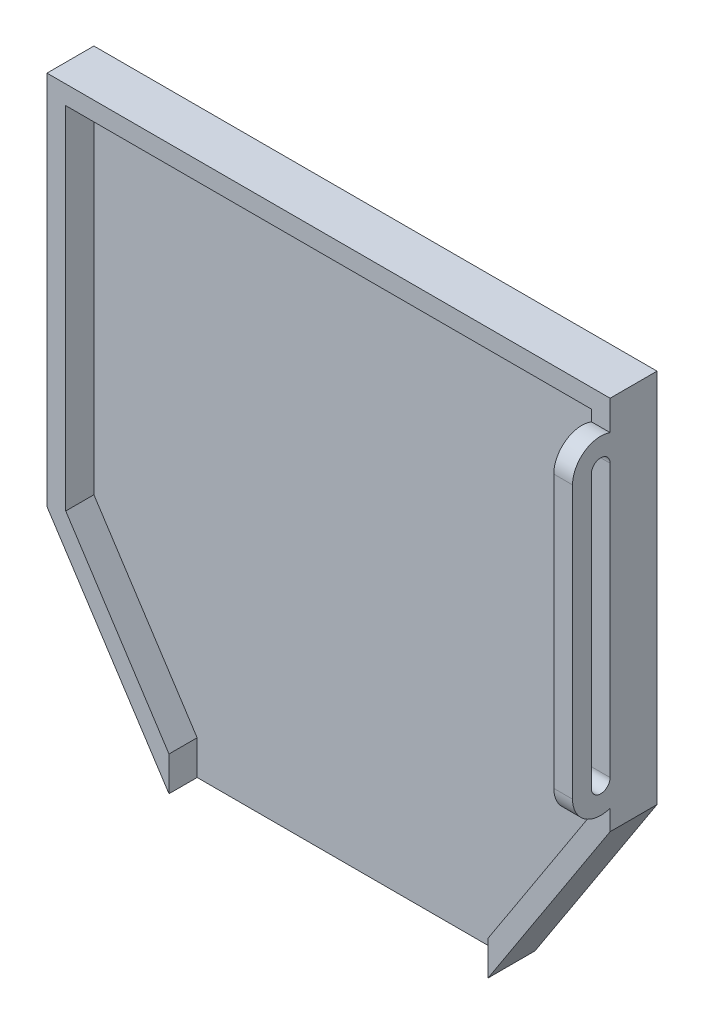
ISO-10303-21;
HEADER;
FILE_DESCRIPTION(('STEP AP214'),'2;1');
FILE_NAME('part.step','',(''),(''),'','','');
FILE_SCHEMA(('AUTOMOTIVE_DESIGN { 1 0 10303 214 1 1 1 1 }'));
ENDSEC;
DATA;
#1=APPLICATION_CONTEXT('core data for automotive mechanical design processes');
#2=APPLICATION_PROTOCOL_DEFINITION('international standard','automotive_design',2000,#1);
#3=PRODUCT_CONTEXT('',#1,'mechanical');
#4=PRODUCT('Part','Part','',(#3));
#5=PRODUCT_RELATED_PRODUCT_CATEGORY('part','',(#4));
#6=PRODUCT_DEFINITION_FORMATION('','',#4);
#7=PRODUCT_DEFINITION_CONTEXT('part definition',#1,'design');
#8=PRODUCT_DEFINITION('design','',#6,#7);
#9=PRODUCT_DEFINITION_SHAPE('','',#8);
#10=(LENGTH_UNIT() NAMED_UNIT(*) SI_UNIT(.MILLI.,.METRE.));
#11=(NAMED_UNIT(*) PLANE_ANGLE_UNIT() SI_UNIT($,.RADIAN.));
#12=(NAMED_UNIT(*) SI_UNIT($,.STERADIAN.) SOLID_ANGLE_UNIT());
#13=UNCERTAINTY_MEASURE_WITH_UNIT(LENGTH_MEASURE(1.E-05),#10,'distance_accuracy_value','');
#14=(GEOMETRIC_REPRESENTATION_CONTEXT(3) GLOBAL_UNCERTAINTY_ASSIGNED_CONTEXT((#13)) GLOBAL_UNIT_ASSIGNED_CONTEXT((#10,
#11,#12)) REPRESENTATION_CONTEXT('',''));
#15=CARTESIAN_POINT('',(0.,0.,0.));
#16=DIRECTION('',(0.,0.,1.));
#17=DIRECTION('',(1.,0.,0.));
#18=AXIS2_PLACEMENT_3D('',#15,#16,#17);
#19=CARTESIAN_POINT('',(0.,0.,5.));
#20=DIRECTION('',(0.,0.,-1.));
#21=DIRECTION('',(-1.,0.,0.));
#22=AXIS2_PLACEMENT_3D('',#19,#20,#21);
#23=PLANE('',#22);
#24=DIRECTION('',(1.,0.,0.));
#25=VECTOR('',#24,1.);
#26=CARTESIAN_POINT('',(45.,54.,5.));
#27=LINE('',#26,#25);
#28=CARTESIAN_POINT('',(45.,54.,5.));
#29=VERTEX_POINT('',#28);
#30=CARTESIAN_POINT('',(47.,54.,5.));
#31=VERTEX_POINT('',#30);
#32=EDGE_CURVE('E258',#29,#31,#27,.T.);
#33=ORIENTED_EDGE('',*,*,#32,.F.);
#34=DIRECTION('',(0.,-1.,0.));
#35=VECTOR('',#34,1.);
#36=CARTESIAN_POINT('',(45.,20.592880135962,5.));
#37=LINE('',#36,#35);
#38=CARTESIAN_POINT('',(45.,25.,5.));
#39=VERTEX_POINT('',#38);
#40=EDGE_CURVE('E296',#29,#39,#37,.T.);
#41=ORIENTED_EDGE('',*,*,#40,.T.);
#42=DIRECTION('',(1.,0.,0.));
#43=VECTOR('',#42,1.);
#44=CARTESIAN_POINT('',(45.,25.,5.));
#45=LINE('',#44,#43);
#46=CARTESIAN_POINT('',(47.,25.,5.));
#47=VERTEX_POINT('',#46);
#48=EDGE_CURVE('E267',#39,#47,#45,.T.);
#49=ORIENTED_EDGE('',*,*,#48,.T.);
#50=DIRECTION('',(0.,1.,0.));
#51=VECTOR('',#50,1.);
#52=CARTESIAN_POINT('',(47.,20.,5.));
#53=LINE('',#52,#51);
#54=EDGE_CURVE('E57',#47,#31,#53,.T.);
#55=ORIENTED_EDGE('',*,*,#54,.T.);
#56=EDGE_LOOP('',(#33,#41,#49,#55));
#57=FACE_BOUND('',#56,.T.);
#58=ADVANCED_FACE('F41',(#57),#23,.F.);
#59=CARTESIAN_POINT('',(45.,58.,5.));
#60=VERTEX_POINT('',#59);
#61=CARTESIAN_POINT('',(45.,56.8284271247462,5.));
#62=VERTEX_POINT('',#61);
#63=EDGE_CURVE('E292',#60,#62,#37,.T.);
#64=ORIENTED_EDGE('',*,*,#63,.T.);
#65=DIRECTION('',(1.,0.,0.));
#66=VECTOR('',#65,1.);
#67=CARTESIAN_POINT('',(45.,56.8284271247462,5.));
#68=LINE('',#67,#66);
#69=CARTESIAN_POINT('',(47.,56.8284271247462,5.));
#70=VERTEX_POINT('',#69);
#71=EDGE_CURVE('E254',#62,#70,#68,.T.);
#72=ORIENTED_EDGE('',*,*,#71,.T.);
#73=CARTESIAN_POINT('',(47.,60.,5.));
#74=VERTEX_POINT('',#73);
#75=EDGE_CURVE('E305',#70,#74,#53,.T.);
#76=ORIENTED_EDGE('',*,*,#75,.T.);
#77=DIRECTION('',(-1.,0.,0.));
#78=VECTOR('',#77,1.);
#79=CARTESIAN_POINT('',(47.,60.,5.));
#80=LINE('',#79,#78);
#81=CARTESIAN_POINT('',(-13.,60.,5.));
#82=VERTEX_POINT('',#81);
#83=EDGE_CURVE('E308',#74,#82,#80,.T.);
#84=ORIENTED_EDGE('',*,*,#83,.T.);
#85=DIRECTION('',(0.,-1.,0.));
#86=VECTOR('',#85,1.);
#87=CARTESIAN_POINT('',(-13.,60.,5.));
#88=LINE('',#87,#86);
#89=CARTESIAN_POINT('',(-13.,20.,5.));
#90=VERTEX_POINT('',#89);
#91=EDGE_CURVE('E272',#82,#90,#88,.T.);
#92=ORIENTED_EDGE('',*,*,#91,.T.);
#93=DIRECTION('',(0.544988350595414,-0.838443616300637,0.));
#94=VECTOR('',#93,1.);
#95=CARTESIAN_POINT('',(-13.,20.,5.));
#96=LINE('',#95,#94);
#97=CARTESIAN_POINT('',(0.,0.,5.));
#98=VERTEX_POINT('',#97);
#99=EDGE_CURVE('E276',#90,#98,#96,.T.);
#100=ORIENTED_EDGE('',*,*,#99,.T.);
#101=DIRECTION('',(0.,1.,0.));
#102=VECTOR('',#101,1.);
#103=CARTESIAN_POINT('',(0.,0.,5.));
#104=LINE('',#103,#102);
#105=CARTESIAN_POINT('',(0.,3.66980321288508,5.));
#106=VERTEX_POINT('',#105);
#107=EDGE_CURVE('E280',#98,#106,#104,.T.);
#108=ORIENTED_EDGE('',*,*,#107,.T.);
#109=DIRECTION('',(-0.544988350595414,0.838443616300637,0.));
#110=VECTOR('',#109,1.);
#111=CARTESIAN_POINT('',(-11.,20.592880135962,5.));
#112=LINE('',#111,#110);
#113=CARTESIAN_POINT('',(-11.,20.592880135962,5.));
#114=VERTEX_POINT('',#113);
#115=EDGE_CURVE('E283',#106,#114,#112,.T.);
#116=ORIENTED_EDGE('',*,*,#115,.T.);
#117=DIRECTION('',(0.,1.,0.));
#118=VECTOR('',#117,1.);
#119=CARTESIAN_POINT('',(-11.,58.,5.));
#120=LINE('',#119,#118);
#121=CARTESIAN_POINT('',(-11.,58.,5.));
#122=VERTEX_POINT('',#121);
#123=EDGE_CURVE('E286',#114,#122,#120,.T.);
#124=ORIENTED_EDGE('',*,*,#123,.T.);
#125=DIRECTION('',(1.,0.,0.));
#126=VECTOR('',#125,1.);
#127=CARTESIAN_POINT('',(45.,58.,5.));
#128=LINE('',#127,#126);
#129=EDGE_CURVE('E289',#122,#60,#128,.T.);
#130=ORIENTED_EDGE('',*,*,#129,.T.);
#131=EDGE_LOOP('',(#64,#72,#76,#84,#92,#100,#108,#116,#124,#130));
#132=FACE_BOUND('',#131,.T.);
#133=ADVANCED_FACE('F430',(#132),#23,.F.);
#134=CARTESIAN_POINT('',(-13.,20.,2.));
#135=DIRECTION('',(0.838443616300637,0.544988350595414,0.));
#136=DIRECTION('',(-0.544988350595414,0.838443616300637,0.));
#137=AXIS2_PLACEMENT_3D('',#134,#135,#136);
#138=PLANE('',#137);
#139=DIRECTION('',(0.544988350595414,-0.838443616300637,0.));
#140=VECTOR('',#139,1.);
#141=CARTESIAN_POINT('',(-13.,20.,0.));
#142=LINE('',#141,#140);
#143=CARTESIAN_POINT('',(-13.,20.,0.));
#144=VERTEX_POINT('',#143);
#145=CARTESIAN_POINT('',(0.,0.,0.));
#146=VERTEX_POINT('',#145);
#147=EDGE_CURVE('E369',#144,#146,#142,.T.);
#148=ORIENTED_EDGE('',*,*,#147,.T.);
#149=DIRECTION('',(0.,0.,-1.));
#150=VECTOR('',#149,1.);
#151=CARTESIAN_POINT('',(0.,0.,2.));
#152=LINE('',#151,#150);
#153=CARTESIAN_POINT('',(0.,0.,2.));
#154=VERTEX_POINT('',#153);
#155=EDGE_CURVE('E11',#154,#146,#152,.T.);
#156=ORIENTED_EDGE('',*,*,#155,.F.);
#157=DIRECTION('',(0.,0.,-1.));
#158=VECTOR('',#157,1.);
#159=CARTESIAN_POINT('',(0.,0.,5.));
#160=LINE('',#159,#158);
#161=EDGE_CURVE('E365',#98,#154,#160,.T.);
#162=ORIENTED_EDGE('',*,*,#161,.F.);
#163=ORIENTED_EDGE('',*,*,#99,.F.);
#164=DIRECTION('',(0.,0.,-1.));
#165=VECTOR('',#164,1.);
#166=CARTESIAN_POINT('',(-13.,20.,2.));
#167=LINE('',#166,#165);
#168=EDGE_CURVE('E373',#90,#144,#167,.T.);
#169=ORIENTED_EDGE('',*,*,#168,.T.);
#170=EDGE_LOOP('',(#148,#156,#162,#163,#169));
#171=FACE_BOUND('',#170,.T.);
#172=ADVANCED_FACE('F43',(#171),#138,.F.);
#173=CARTESIAN_POINT('',(0.,0.,2.));
#174=DIRECTION('',(0.,1.,0.));
#175=DIRECTION('',(0.,0.,1.));
#176=AXIS2_PLACEMENT_3D('',#173,#174,#175);
#177=PLANE('',#176);
#178=DIRECTION('',(1.,0.,0.));
#179=VECTOR('',#178,1.);
#180=CARTESIAN_POINT('',(0.,0.,0.));
#181=LINE('',#180,#179);
#182=CARTESIAN_POINT('',(34.,0.,0.));
#183=VERTEX_POINT('',#182);
#184=EDGE_CURVE('E378',#146,#183,#181,.T.);
#185=ORIENTED_EDGE('',*,*,#184,.T.);
#186=DIRECTION('',(0.,0.,-1.));
#187=VECTOR('',#186,1.);
#188=CARTESIAN_POINT('',(34.,0.,2.));
#189=LINE('',#188,#187);
#190=CARTESIAN_POINT('',(34.,0.,2.));
#191=VERTEX_POINT('',#190);
#192=EDGE_CURVE('E50',#191,#183,#189,.T.);
#193=ORIENTED_EDGE('',*,*,#192,.F.);
#194=DIRECTION('',(1.,0.,0.));
#195=VECTOR('',#194,1.);
#196=CARTESIAN_POINT('',(0.,0.,2.));
#197=LINE('',#196,#195);
#198=EDGE_CURVE('E370',#154,#191,#197,.T.);
#199=ORIENTED_EDGE('',*,*,#198,.F.);
#200=ORIENTED_EDGE('',*,*,#155,.T.);
#201=EDGE_LOOP('',(#185,#193,#199,#200));
#202=FACE_BOUND('',#201,.T.);
#203=ADVANCED_FACE('F472',(#202),#177,.F.);
#204=CARTESIAN_POINT('',(34.,0.,2.));
#205=DIRECTION('',(-0.838443616300637,0.544988350595414,0.));
#206=DIRECTION('',(-0.544988350595414,-0.838443616300637,0.));
#207=AXIS2_PLACEMENT_3D('',#204,#205,#206);
#208=PLANE('',#207);
#209=DIRECTION('',(0.544988350595414,0.838443616300637,0.));
#210=VECTOR('',#209,1.);
#211=CARTESIAN_POINT('',(34.,0.,0.));
#212=LINE('',#211,#210);
#213=CARTESIAN_POINT('',(47.,20.,0.));
#214=VERTEX_POINT('',#213);
#215=EDGE_CURVE('E381',#183,#214,#212,.T.);
#216=ORIENTED_EDGE('',*,*,#215,.T.);
#217=DIRECTION('',(0.,0.,-1.));
#218=VECTOR('',#217,1.);
#219=CARTESIAN_POINT('',(47.,20.,2.));
#220=LINE('',#219,#218);
#221=CARTESIAN_POINT('',(47.,20.,5.));
#222=VERTEX_POINT('',#221);
#223=EDGE_CURVE('E403',#222,#214,#220,.T.);
#224=ORIENTED_EDGE('',*,*,#223,.F.);
#225=DIRECTION('',(0.544988350595414,0.838443616300637,0.));
#226=VECTOR('',#225,1.);
#227=CARTESIAN_POINT('',(34.,0.,5.));
#228=LINE('',#227,#226);
#229=CARTESIAN_POINT('',(34.,0.,5.));
#230=VERTEX_POINT('',#229);
#231=EDGE_CURVE('E302',#230,#222,#228,.T.);
#232=ORIENTED_EDGE('',*,*,#231,.F.);
#233=DIRECTION('',(0.,0.,-1.));
#234=VECTOR('',#233,1.);
#235=CARTESIAN_POINT('',(34.,0.,5.));
#236=LINE('',#235,#234);
#237=EDGE_CURVE('E312',#230,#191,#236,.T.);
#238=ORIENTED_EDGE('',*,*,#237,.T.);
#239=ORIENTED_EDGE('',*,*,#192,.T.);
#240=EDGE_LOOP('',(#216,#224,#232,#238,#239));
#241=FACE_BOUND('',#240,.T.);
#242=ADVANCED_FACE('F411',(#241),#208,.F.);
#243=CARTESIAN_POINT('',(47.,20.,2.));
#244=DIRECTION('',(-1.,0.,0.));
#245=DIRECTION('',(0.,0.,1.));
#246=AXIS2_PLACEMENT_3D('',#243,#244,#245);
#247=PLANE('',#246);
#248=CARTESIAN_POINT('',(47.,54.,6.));
#249=DIRECTION('',(1.,0.,0.));
#250=DIRECTION('',(0.,0.,-1.));
#251=AXIS2_PLACEMENT_3D('',#248,#249,#250);
#252=CIRCLE('',#251,1.);
#253=CARTESIAN_POINT('',(47.,54.,7.));
#254=VERTEX_POINT('',#253);
#255=EDGE_CURVE('E244',#31,#254,#252,.T.);
#256=ORIENTED_EDGE('',*,*,#255,.F.);
#257=ORIENTED_EDGE('',*,*,#54,.F.);
#258=CARTESIAN_POINT('',(47.,25.,6.));
#259=DIRECTION('',(1.,0.,0.));
#260=DIRECTION('',(0.,0.,-1.));
#261=AXIS2_PLACEMENT_3D('',#258,#259,#260);
#262=CIRCLE('',#261,1.);
#263=CARTESIAN_POINT('',(47.,25.,7.));
#264=VERTEX_POINT('',#263);
#265=EDGE_CURVE('E236',#264,#47,#262,.T.);
#266=ORIENTED_EDGE('',*,*,#265,.F.);
#267=DIRECTION('',(0.,1.,0.));
#268=VECTOR('',#267,1.);
#269=CARTESIAN_POINT('',(47.,0.,7.));
#270=LINE('',#269,#268);
#271=EDGE_CURVE('E240',#264,#254,#270,.T.);
#272=ORIENTED_EDGE('',*,*,#271,.T.);
#273=EDGE_LOOP('',(#256,#257,#266,#272));
#274=FACE_BOUND('',#273,.T.);
#275=DIRECTION('',(0.,1.,0.));
#276=VECTOR('',#275,1.);
#277=CARTESIAN_POINT('',(47.,20.,0.));
#278=LINE('',#277,#276);
#279=CARTESIAN_POINT('',(47.,60.,0.));
#280=VERTEX_POINT('',#279);
#281=EDGE_CURVE('E384',#214,#280,#278,.T.);
#282=ORIENTED_EDGE('',*,*,#281,.T.);
#283=DIRECTION('',(0.,0.,-1.));
#284=VECTOR('',#283,1.);
#285=CARTESIAN_POINT('',(47.,60.,2.));
#286=LINE('',#285,#284);
#287=EDGE_CURVE('E399',#74,#280,#286,.T.);
#288=ORIENTED_EDGE('',*,*,#287,.F.);
#289=ORIENTED_EDGE('',*,*,#75,.F.);
#290=CARTESIAN_POINT('',(47.,54.,6.));
#291=DIRECTION('',(1.,0.,0.));
#292=DIRECTION('',(0.,0.,-1.));
#293=AXIS2_PLACEMENT_3D('',#290,#291,#292);
#294=CIRCLE('',#293,3.);
#295=CARTESIAN_POINT('',(47.,54.,9.));
#296=VERTEX_POINT('',#295);
#297=EDGE_CURVE('E208',#70,#296,#294,.T.);
#298=ORIENTED_EDGE('',*,*,#297,.T.);
#299=DIRECTION('',(0.,1.,0.));
#300=VECTOR('',#299,1.);
#301=CARTESIAN_POINT('',(47.,0.,9.));
#302=LINE('',#301,#300);
#303=CARTESIAN_POINT('',(47.,25.,9.));
#304=VERTEX_POINT('',#303);
#305=EDGE_CURVE('E231',#304,#296,#302,.T.);
#306=ORIENTED_EDGE('',*,*,#305,.F.);
#307=CARTESIAN_POINT('',(47.,25.,6.));
#308=DIRECTION('',(1.,0.,0.));
#309=DIRECTION('',(0.,0.,-1.));
#310=AXIS2_PLACEMENT_3D('',#307,#308,#309);
#311=CIRCLE('',#310,3.);
#312=CARTESIAN_POINT('',(47.,22.1715728752538,5.));
#313=VERTEX_POINT('',#312);
#314=EDGE_CURVE('E192',#304,#313,#311,.T.);
#315=ORIENTED_EDGE('',*,*,#314,.T.);
#316=EDGE_CURVE('E65',#222,#313,#53,.T.);
#317=ORIENTED_EDGE('',*,*,#316,.F.);
#318=ORIENTED_EDGE('',*,*,#223,.T.);
#319=EDGE_LOOP('',(#282,#288,#289,#298,#306,#315,#317,#318));
#320=FACE_BOUND('',#319,.T.);
#321=ADVANCED_FACE('F424',(#274,#320),#247,.F.);
#322=CARTESIAN_POINT('',(47.,60.,2.));
#323=DIRECTION('',(0.,-1.,0.));
#324=DIRECTION('',(0.,0.,-1.));
#325=AXIS2_PLACEMENT_3D('',#322,#323,#324);
#326=PLANE('',#325);
#327=DIRECTION('',(-1.,0.,0.));
#328=VECTOR('',#327,1.);
#329=CARTESIAN_POINT('',(47.,60.,0.));
#330=LINE('',#329,#328);
#331=CARTESIAN_POINT('',(-13.,60.,0.));
#332=VERTEX_POINT('',#331);
#333=EDGE_CURVE('E387',#280,#332,#330,.T.);
#334=ORIENTED_EDGE('',*,*,#333,.T.);
#335=DIRECTION('',(0.,0.,-1.));
#336=VECTOR('',#335,1.);
#337=CARTESIAN_POINT('',(-13.,60.,2.));
#338=LINE('',#337,#336);
#339=EDGE_CURVE('E395',#82,#332,#338,.T.);
#340=ORIENTED_EDGE('',*,*,#339,.F.);
#341=ORIENTED_EDGE('',*,*,#83,.F.);
#342=ORIENTED_EDGE('',*,*,#287,.T.);
#343=EDGE_LOOP('',(#334,#340,#341,#342));
#344=FACE_BOUND('',#343,.T.);
#345=ADVANCED_FACE('F427',(#344),#326,.F.);
#346=CARTESIAN_POINT('',(-13.,60.,2.));
#347=DIRECTION('',(1.,0.,0.));
#348=DIRECTION('',(0.,1.,0.));
#349=AXIS2_PLACEMENT_3D('',#346,#347,#348);
#350=PLANE('',#349);
#351=DIRECTION('',(0.,-1.,0.));
#352=VECTOR('',#351,1.);
#353=CARTESIAN_POINT('',(-13.,60.,0.));
#354=LINE('',#353,#352);
#355=EDGE_CURVE('E374',#332,#144,#354,.T.);
#356=ORIENTED_EDGE('',*,*,#355,.T.);
#357=ORIENTED_EDGE('',*,*,#168,.F.);
#358=ORIENTED_EDGE('',*,*,#91,.F.);
#359=ORIENTED_EDGE('',*,*,#339,.T.);
#360=EDGE_LOOP('',(#356,#357,#358,#359));
#361=FACE_BOUND('',#360,.T.);
#362=ADVANCED_FACE('F432',(#361),#350,.F.);
#363=CARTESIAN_POINT('',(0.,0.,2.));
#364=DIRECTION('',(0.,0.,1.));
#365=DIRECTION('',(1.,0.,0.));
#366=AXIS2_PLACEMENT_3D('',#363,#364,#365);
#367=PLANE('',#366);
#368=DIRECTION('',(0.,-1.,0.));
#369=VECTOR('',#368,1.);
#370=CARTESIAN_POINT('',(34.,0.,2.));
#371=LINE('',#370,#369);
#372=CARTESIAN_POINT('',(34.,3.6698032128851,2.));
#373=VERTEX_POINT('',#372);
#374=EDGE_CURVE('E277',#373,#191,#371,.T.);
#375=ORIENTED_EDGE('',*,*,#374,.F.);
#376=DIRECTION('',(-0.544988350595414,-0.838443616300637,0.));
#377=VECTOR('',#376,1.);
#378=CARTESIAN_POINT('',(34.,3.6698032128851,2.));
#379=LINE('',#378,#377);
#380=CARTESIAN_POINT('',(45.,20.592880135962,2.));
#381=VERTEX_POINT('',#380);
#382=EDGE_CURVE('E331',#381,#373,#379,.T.);
#383=ORIENTED_EDGE('',*,*,#382,.F.);
#384=DIRECTION('',(0.,-1.,0.));
#385=VECTOR('',#384,1.);
#386=CARTESIAN_POINT('',(45.,20.592880135962,2.));
#387=LINE('',#386,#385);
#388=CARTESIAN_POINT('',(45.,58.,2.));
#389=VERTEX_POINT('',#388);
#390=EDGE_CURVE('E328',#389,#381,#387,.T.);
#391=ORIENTED_EDGE('',*,*,#390,.F.);
#392=DIRECTION('',(1.,0.,0.));
#393=VECTOR('',#392,1.);
#394=CARTESIAN_POINT('',(45.,58.,2.));
#395=LINE('',#394,#393);
#396=CARTESIAN_POINT('',(-11.,58.,2.));
#397=VERTEX_POINT('',#396);
#398=EDGE_CURVE('E324',#397,#389,#395,.T.);
#399=ORIENTED_EDGE('',*,*,#398,.F.);
#400=DIRECTION('',(0.,1.,0.));
#401=VECTOR('',#400,1.);
#402=CARTESIAN_POINT('',(-11.,58.,2.));
#403=LINE('',#402,#401);
#404=CARTESIAN_POINT('',(-11.,20.592880135962,2.));
#405=VERTEX_POINT('',#404);
#406=EDGE_CURVE('E320',#405,#397,#403,.T.);
#407=ORIENTED_EDGE('',*,*,#406,.F.);
#408=DIRECTION('',(-0.544988350595414,0.838443616300637,0.));
#409=VECTOR('',#408,1.);
#410=CARTESIAN_POINT('',(-11.,20.592880135962,2.));
#411=LINE('',#410,#409);
#412=CARTESIAN_POINT('',(0.,3.66980321288508,2.));
#413=VERTEX_POINT('',#412);
#414=EDGE_CURVE('E316',#413,#405,#411,.T.);
#415=ORIENTED_EDGE('',*,*,#414,.F.);
#416=DIRECTION('',(0.,1.,0.));
#417=VECTOR('',#416,1.);
#418=CARTESIAN_POINT('',(0.,0.,2.));
#419=LINE('',#418,#417);
#420=EDGE_CURVE('E253',#154,#413,#419,.T.);
#421=ORIENTED_EDGE('',*,*,#420,.F.);
#422=ORIENTED_EDGE('',*,*,#198,.T.);
#423=EDGE_LOOP('',(#375,#383,#391,#399,#407,#415,#421,#422));
#424=FACE_BOUND('',#423,.T.);
#425=ADVANCED_FACE('F471',(#424),#367,.T.);
#426=CARTESIAN_POINT('',(0.,0.,0.));
#427=DIRECTION('',(0.,0.,1.));
#428=DIRECTION('',(1.,0.,0.));
#429=AXIS2_PLACEMENT_3D('',#426,#427,#428);
#430=PLANE('',#429);
#431=ORIENTED_EDGE('',*,*,#147,.F.);
#432=ORIENTED_EDGE('',*,*,#355,.F.);
#433=ORIENTED_EDGE('',*,*,#333,.F.);
#434=ORIENTED_EDGE('',*,*,#281,.F.);
#435=ORIENTED_EDGE('',*,*,#215,.F.);
#436=ORIENTED_EDGE('',*,*,#184,.F.);
#437=EDGE_LOOP('',(#431,#432,#433,#434,#435,#436));
#438=FACE_BOUND('',#437,.T.);
#439=ADVANCED_FACE('F419',(#438),#430,.F.);
#440=CARTESIAN_POINT('',(0.,0.,5.));
#441=DIRECTION('',(-1.,0.,0.));
#442=DIRECTION('',(0.,-1.,0.));
#443=AXIS2_PLACEMENT_3D('',#440,#441,#442);
#444=PLANE('',#443);
#445=ORIENTED_EDGE('',*,*,#420,.T.);
#446=DIRECTION('',(0.,0.,-1.));
#447=VECTOR('',#446,1.);
#448=CARTESIAN_POINT('',(0.,3.66980321288508,5.));
#449=LINE('',#448,#447);
#450=EDGE_CURVE('E361',#106,#413,#449,.T.);
#451=ORIENTED_EDGE('',*,*,#450,.F.);
#452=ORIENTED_EDGE('',*,*,#107,.F.);
#453=ORIENTED_EDGE('',*,*,#161,.T.);
#454=EDGE_LOOP('',(#445,#451,#452,#453));
#455=FACE_BOUND('',#454,.T.);
#456=ADVANCED_FACE('F442',(#455),#444,.F.);
#457=CARTESIAN_POINT('',(-11.,20.592880135962,5.));
#458=DIRECTION('',(-0.838443616300637,-0.544988350595414,0.));
#459=DIRECTION('',(0.544988350595414,-0.838443616300637,0.));
#460=AXIS2_PLACEMENT_3D('',#457,#458,#459);
#461=PLANE('',#460);
#462=ORIENTED_EDGE('',*,*,#414,.T.);
#463=DIRECTION('',(0.,0.,-1.));
#464=VECTOR('',#463,1.);
#465=CARTESIAN_POINT('',(-11.,20.592880135962,5.));
#466=LINE('',#465,#464);
#467=EDGE_CURVE('E357',#114,#405,#466,.T.);
#468=ORIENTED_EDGE('',*,*,#467,.F.);
#469=ORIENTED_EDGE('',*,*,#115,.F.);
#470=ORIENTED_EDGE('',*,*,#450,.T.);
#471=EDGE_LOOP('',(#462,#468,#469,#470));
#472=FACE_BOUND('',#471,.T.);
#473=ADVANCED_FACE('F444',(#472),#461,.F.);
#474=CARTESIAN_POINT('',(-11.,58.,5.));
#475=DIRECTION('',(-1.,0.,0.));
#476=DIRECTION('',(0.,0.,1.));
#477=AXIS2_PLACEMENT_3D('',#474,#475,#476);
#478=PLANE('',#477);
#479=ORIENTED_EDGE('',*,*,#406,.T.);
#480=DIRECTION('',(0.,0.,-1.));
#481=VECTOR('',#480,1.);
#482=CARTESIAN_POINT('',(-11.,58.,5.));
#483=LINE('',#482,#481);
#484=EDGE_CURVE('E353',#122,#397,#483,.T.);
#485=ORIENTED_EDGE('',*,*,#484,.F.);
#486=ORIENTED_EDGE('',*,*,#123,.F.);
#487=ORIENTED_EDGE('',*,*,#467,.T.);
#488=EDGE_LOOP('',(#479,#485,#486,#487));
#489=FACE_BOUND('',#488,.T.);
#490=ADVANCED_FACE('F448',(#489),#478,.F.);
#491=CARTESIAN_POINT('',(45.,58.,5.));
#492=DIRECTION('',(0.,1.,0.));
#493=DIRECTION('',(0.,0.,1.));
#494=AXIS2_PLACEMENT_3D('',#491,#492,#493);
#495=PLANE('',#494);
#496=ORIENTED_EDGE('',*,*,#398,.T.);
#497=DIRECTION('',(0.,0.,-1.));
#498=VECTOR('',#497,1.);
#499=CARTESIAN_POINT('',(45.,58.,5.));
#500=LINE('',#499,#498);
#501=EDGE_CURVE('E349',#60,#389,#500,.T.);
#502=ORIENTED_EDGE('',*,*,#501,.F.);
#503=ORIENTED_EDGE('',*,*,#129,.F.);
#504=ORIENTED_EDGE('',*,*,#484,.T.);
#505=EDGE_LOOP('',(#496,#502,#503,#504));
#506=FACE_BOUND('',#505,.T.);
#507=ADVANCED_FACE('F454',(#506),#495,.F.);
#508=CARTESIAN_POINT('',(45.,20.592880135962,5.));
#509=DIRECTION('',(1.,0.,0.));
#510=DIRECTION('',(0.,0.,-1.));
#511=AXIS2_PLACEMENT_3D('',#508,#509,#510);
#512=PLANE('',#511);
#513=ORIENTED_EDGE('',*,*,#40,.F.);
#514=CARTESIAN_POINT('',(45.,54.,6.));
#515=DIRECTION('',(1.,0.,0.));
#516=DIRECTION('',(0.,0.,-1.));
#517=AXIS2_PLACEMENT_3D('',#514,#515,#516);
#518=CIRCLE('',#517,1.);
#519=CARTESIAN_POINT('',(45.,54.,7.));
#520=VERTEX_POINT('',#519);
#521=EDGE_CURVE('E226',#29,#520,#518,.T.);
#522=ORIENTED_EDGE('',*,*,#521,.T.);
#523=DIRECTION('',(0.,1.,0.));
#524=VECTOR('',#523,1.);
#525=CARTESIAN_POINT('',(45.,0.,7.));
#526=LINE('',#525,#524);
#527=CARTESIAN_POINT('',(45.,25.,7.));
#528=VERTEX_POINT('',#527);
#529=EDGE_CURVE('E220',#528,#520,#526,.T.);
#530=ORIENTED_EDGE('',*,*,#529,.F.);
#531=CARTESIAN_POINT('',(45.,25.,6.));
#532=DIRECTION('',(1.,0.,0.));
#533=DIRECTION('',(0.,0.,-1.));
#534=AXIS2_PLACEMENT_3D('',#531,#532,#533);
#535=CIRCLE('',#534,1.);
#536=EDGE_CURVE('E216',#528,#39,#535,.T.);
#537=ORIENTED_EDGE('',*,*,#536,.T.);
#538=EDGE_LOOP('',(#513,#522,#530,#537));
#539=FACE_BOUND('',#538,.T.);
#540=ORIENTED_EDGE('',*,*,#390,.T.);
#541=DIRECTION('',(0.,0.,-1.));
#542=VECTOR('',#541,1.);
#543=CARTESIAN_POINT('',(45.,20.592880135962,5.));
#544=LINE('',#543,#542);
#545=CARTESIAN_POINT('',(45.,20.592880135962,5.));
#546=VERTEX_POINT('',#545);
#547=EDGE_CURVE('E345',#546,#381,#544,.T.);
#548=ORIENTED_EDGE('',*,*,#547,.F.);
#549=CARTESIAN_POINT('',(45.,22.1715728752538,5.));
#550=VERTEX_POINT('',#549);
#551=EDGE_CURVE('E214',#550,#546,#37,.T.);
#552=ORIENTED_EDGE('',*,*,#551,.F.);
#553=CARTESIAN_POINT('',(45.,25.,6.));
#554=DIRECTION('',(1.,0.,0.));
#555=DIRECTION('',(0.,0.,-1.));
#556=AXIS2_PLACEMENT_3D('',#553,#554,#555);
#557=CIRCLE('',#556,3.);
#558=CARTESIAN_POINT('',(45.,25.,9.));
#559=VERTEX_POINT('',#558);
#560=EDGE_CURVE('E190',#559,#550,#557,.T.);
#561=ORIENTED_EDGE('',*,*,#560,.F.);
#562=DIRECTION('',(0.,1.,0.));
#563=VECTOR('',#562,1.);
#564=CARTESIAN_POINT('',(45.,0.,9.));
#565=LINE('',#564,#563);
#566=CARTESIAN_POINT('',(45.,54.,9.));
#567=VERTEX_POINT('',#566);
#568=EDGE_CURVE('E201',#559,#567,#565,.T.);
#569=ORIENTED_EDGE('',*,*,#568,.T.);
#570=CARTESIAN_POINT('',(45.,54.,6.));
#571=DIRECTION('',(1.,0.,0.));
#572=DIRECTION('',(0.,0.,-1.));
#573=AXIS2_PLACEMENT_3D('',#570,#571,#572);
#574=CIRCLE('',#573,3.);
#575=EDGE_CURVE('E198',#62,#567,#574,.T.);
#576=ORIENTED_EDGE('',*,*,#575,.F.);
#577=ORIENTED_EDGE('',*,*,#63,.F.);
#578=ORIENTED_EDGE('',*,*,#501,.T.);
#579=EDGE_LOOP('',(#540,#548,#552,#561,#569,#576,#577,#578));
#580=FACE_BOUND('',#579,.T.);
#581=ADVANCED_FACE('F212',(#539,#580),#512,.F.);
#582=CARTESIAN_POINT('',(34.,3.6698032128851,5.));
#583=DIRECTION('',(0.838443616300637,-0.544988350595414,0.));
#584=DIRECTION('',(0.544988350595414,0.838443616300637,0.));
#585=AXIS2_PLACEMENT_3D('',#582,#583,#584);
#586=PLANE('',#585);
#587=ORIENTED_EDGE('',*,*,#382,.T.);
#588=DIRECTION('',(0.,0.,-1.));
#589=VECTOR('',#588,1.);
#590=CARTESIAN_POINT('',(34.,3.6698032128851,5.));
#591=LINE('',#590,#589);
#592=CARTESIAN_POINT('',(34.,3.6698032128851,5.));
#593=VERTEX_POINT('',#592);
#594=EDGE_CURVE('E341',#593,#373,#591,.T.);
#595=ORIENTED_EDGE('',*,*,#594,.F.);
#596=DIRECTION('',(-0.544988350595414,-0.838443616300637,0.));
#597=VECTOR('',#596,1.);
#598=CARTESIAN_POINT('',(34.,3.6698032128851,5.));
#599=LINE('',#598,#597);
#600=EDGE_CURVE('E295',#546,#593,#599,.T.);
#601=ORIENTED_EDGE('',*,*,#600,.F.);
#602=ORIENTED_EDGE('',*,*,#547,.T.);
#603=EDGE_LOOP('',(#587,#595,#601,#602));
#604=FACE_BOUND('',#603,.T.);
#605=ADVANCED_FACE('F466',(#604),#586,.F.);
#606=CARTESIAN_POINT('',(34.,0.,5.));
#607=DIRECTION('',(1.,0.,0.));
#608=DIRECTION('',(0.,0.,-1.));
#609=AXIS2_PLACEMENT_3D('',#606,#607,#608);
#610=PLANE('',#609);
#611=ORIENTED_EDGE('',*,*,#374,.T.);
#612=ORIENTED_EDGE('',*,*,#237,.F.);
#613=DIRECTION('',(0.,-1.,0.));
#614=VECTOR('',#613,1.);
#615=CARTESIAN_POINT('',(34.,0.,5.));
#616=LINE('',#615,#614);
#617=EDGE_CURVE('E299',#593,#230,#616,.T.);
#618=ORIENTED_EDGE('',*,*,#617,.F.);
#619=ORIENTED_EDGE('',*,*,#594,.T.);
#620=EDGE_LOOP('',(#611,#612,#618,#619));
#621=FACE_BOUND('',#620,.T.);
#622=ADVANCED_FACE('F469',(#621),#610,.F.);
#623=ORIENTED_EDGE('',*,*,#316,.T.);
#624=DIRECTION('',(1.,0.,0.));
#625=VECTOR('',#624,1.);
#626=CARTESIAN_POINT('',(45.,22.1715728752538,5.));
#627=LINE('',#626,#625);
#628=EDGE_CURVE('E197',#550,#313,#627,.T.);
#629=ORIENTED_EDGE('',*,*,#628,.F.);
#630=ORIENTED_EDGE('',*,*,#551,.T.);
#631=ORIENTED_EDGE('',*,*,#600,.T.);
#632=ORIENTED_EDGE('',*,*,#617,.T.);
#633=ORIENTED_EDGE('',*,*,#231,.T.);
#634=EDGE_LOOP('',(#623,#629,#630,#631,#632,#633));
#635=FACE_BOUND('',#634,.T.);
#636=ADVANCED_FACE('F462',(#635),#23,.F.);
#637=CARTESIAN_POINT('',(45.,0.,9.));
#638=DIRECTION('',(0.,0.,-1.));
#639=DIRECTION('',(-1.,0.,0.));
#640=AXIS2_PLACEMENT_3D('',#637,#638,#639);
#641=PLANE('',#640);
#642=ORIENTED_EDGE('',*,*,#305,.T.);
#643=DIRECTION('',(1.,0.,0.));
#644=VECTOR('',#643,1.);
#645=CARTESIAN_POINT('',(45.,54.,9.));
#646=LINE('',#645,#644);
#647=EDGE_CURVE('E203',#567,#296,#646,.T.);
#648=ORIENTED_EDGE('',*,*,#647,.F.);
#649=ORIENTED_EDGE('',*,*,#568,.F.);
#650=DIRECTION('',(1.,0.,0.));
#651=VECTOR('',#650,1.);
#652=CARTESIAN_POINT('',(45.,25.,9.));
#653=LINE('',#652,#651);
#654=EDGE_CURVE('E186',#559,#304,#653,.T.);
#655=ORIENTED_EDGE('',*,*,#654,.T.);
#656=EDGE_LOOP('',(#642,#648,#649,#655));
#657=FACE_BOUND('',#656,.T.);
#658=ADVANCED_FACE('F202',(#657),#641,.F.);
#659=CARTESIAN_POINT('',(45.,54.,6.));
#660=DIRECTION('',(1.,0.,0.));
#661=DIRECTION('',(0.,0.,-1.));
#662=AXIS2_PLACEMENT_3D('',#659,#660,#661);
#663=CYLINDRICAL_SURFACE('',#662,3.);
#664=ORIENTED_EDGE('',*,*,#297,.F.);
#665=ORIENTED_EDGE('',*,*,#71,.F.);
#666=ORIENTED_EDGE('',*,*,#575,.T.);
#667=ORIENTED_EDGE('',*,*,#647,.T.);
#668=EDGE_LOOP('',(#664,#665,#666,#667));
#669=FACE_BOUND('',#668,.T.);
#670=ADVANCED_FACE('F457',(#669),#663,.T.);
#671=CARTESIAN_POINT('',(45.,54.,6.));
#672=DIRECTION('',(1.,0.,0.));
#673=DIRECTION('',(0.,0.,-1.));
#674=AXIS2_PLACEMENT_3D('',#671,#672,#673);
#675=CYLINDRICAL_SURFACE('',#674,1.);
#676=ORIENTED_EDGE('',*,*,#255,.T.);
#677=DIRECTION('',(1.,0.,0.));
#678=VECTOR('',#677,1.);
#679=CARTESIAN_POINT('',(45.,54.,7.));
#680=LINE('',#679,#678);
#681=EDGE_CURVE('E261',#520,#254,#680,.T.);
#682=ORIENTED_EDGE('',*,*,#681,.F.);
#683=ORIENTED_EDGE('',*,*,#521,.F.);
#684=ORIENTED_EDGE('',*,*,#32,.T.);
#685=EDGE_LOOP('',(#676,#682,#683,#684));
#686=FACE_BOUND('',#685,.T.);
#687=ADVANCED_FACE('F524',(#686),#675,.F.);
#688=CARTESIAN_POINT('',(45.,0.,7.));
#689=DIRECTION('',(0.,0.,-1.));
#690=DIRECTION('',(-1.,0.,0.));
#691=AXIS2_PLACEMENT_3D('',#688,#689,#690);
#692=PLANE('',#691);
#693=ORIENTED_EDGE('',*,*,#271,.F.);
#694=DIRECTION('',(1.,0.,0.));
#695=VECTOR('',#694,1.);
#696=CARTESIAN_POINT('',(45.,25.,7.));
#697=LINE('',#696,#695);
#698=EDGE_CURVE('E264',#528,#264,#697,.T.);
#699=ORIENTED_EDGE('',*,*,#698,.F.);
#700=ORIENTED_EDGE('',*,*,#529,.T.);
#701=ORIENTED_EDGE('',*,*,#681,.T.);
#702=EDGE_LOOP('',(#693,#699,#700,#701));
#703=FACE_BOUND('',#702,.T.);
#704=ADVANCED_FACE('F533',(#703),#692,.T.);
#705=CARTESIAN_POINT('',(45.,25.,6.));
#706=DIRECTION('',(1.,0.,0.));
#707=DIRECTION('',(0.,0.,-1.));
#708=AXIS2_PLACEMENT_3D('',#705,#706,#707);
#709=CYLINDRICAL_SURFACE('',#708,1.);
#710=ORIENTED_EDGE('',*,*,#265,.T.);
#711=ORIENTED_EDGE('',*,*,#48,.F.);
#712=ORIENTED_EDGE('',*,*,#536,.F.);
#713=ORIENTED_EDGE('',*,*,#698,.T.);
#714=EDGE_LOOP('',(#710,#711,#712,#713));
#715=FACE_BOUND('',#714,.T.);
#716=ADVANCED_FACE('F531',(#715),#709,.F.);
#717=CARTESIAN_POINT('',(45.,25.,6.));
#718=DIRECTION('',(1.,0.,0.));
#719=DIRECTION('',(0.,0.,-1.));
#720=AXIS2_PLACEMENT_3D('',#717,#718,#719);
#721=CYLINDRICAL_SURFACE('',#720,3.);
#722=ORIENTED_EDGE('',*,*,#314,.F.);
#723=ORIENTED_EDGE('',*,*,#654,.F.);
#724=ORIENTED_EDGE('',*,*,#560,.T.);
#725=ORIENTED_EDGE('',*,*,#628,.T.);
#726=EDGE_LOOP('',(#722,#723,#724,#725));
#727=FACE_BOUND('',#726,.T.);
#728=ADVANCED_FACE('F188',(#727),#721,.T.);
#729=CLOSED_SHELL('',(#58,#133,#172,#203,#242,#321,#345,#362,#425,#439,#456,#473,#490,#507,#581,
#605,#622,#636,#658,#670,#687,#704,#716,#728));
#730=MANIFOLD_SOLID_BREP('B2',#729);
#731=ADVANCED_BREP_SHAPE_REPRESENTATION('',(#18,#730),#14);
#732=SHAPE_DEFINITION_REPRESENTATION(#9,#731);
ENDSEC;
END-ISO-10303-21;
